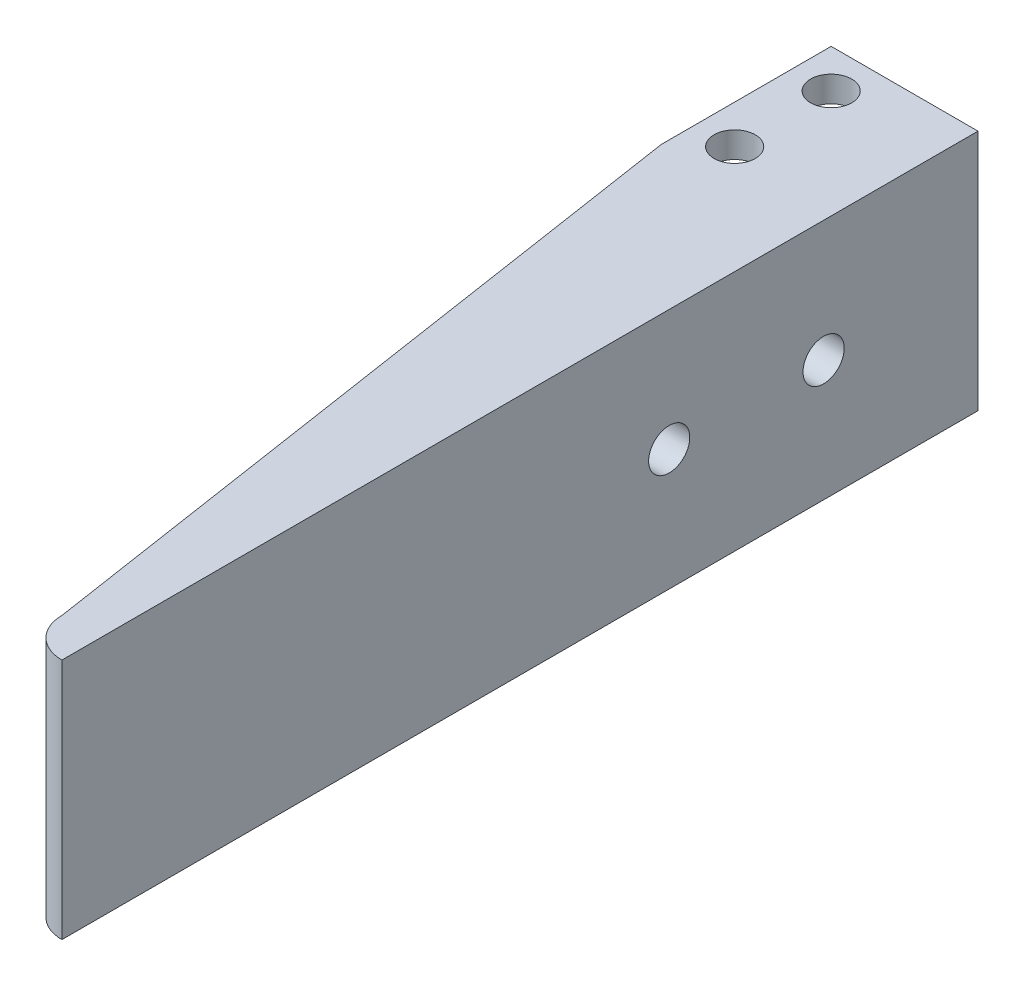
ISO-10303-21;
HEADER;
FILE_DESCRIPTION(('STEP AP214'),'2;1');
FILE_NAME('part.step','',(''),(''),'','','');
FILE_SCHEMA(('AUTOMOTIVE_DESIGN { 1 0 10303 214 1 1 1 1 }'));
ENDSEC;
DATA;
#1=APPLICATION_CONTEXT('core data for automotive mechanical design processes');
#2=APPLICATION_PROTOCOL_DEFINITION('international standard','automotive_design',2000,#1);
#3=PRODUCT_CONTEXT('',#1,'mechanical');
#4=PRODUCT('Part','Part','',(#3));
#5=PRODUCT_RELATED_PRODUCT_CATEGORY('part','',(#4));
#6=PRODUCT_DEFINITION_FORMATION('','',#4);
#7=PRODUCT_DEFINITION_CONTEXT('part definition',#1,'design');
#8=PRODUCT_DEFINITION('design','',#6,#7);
#9=PRODUCT_DEFINITION_SHAPE('','',#8);
#10=(LENGTH_UNIT() NAMED_UNIT(*) SI_UNIT(.MILLI.,.METRE.));
#11=(NAMED_UNIT(*) PLANE_ANGLE_UNIT() SI_UNIT($,.RADIAN.));
#12=(NAMED_UNIT(*) SI_UNIT($,.STERADIAN.) SOLID_ANGLE_UNIT());
#13=UNCERTAINTY_MEASURE_WITH_UNIT(LENGTH_MEASURE(1.E-05),#10,'distance_accuracy_value','');
#14=(GEOMETRIC_REPRESENTATION_CONTEXT(3) GLOBAL_UNCERTAINTY_ASSIGNED_CONTEXT((#13)) GLOBAL_UNIT_ASSIGNED_CONTEXT((#10,
#11,#12)) REPRESENTATION_CONTEXT('',''));
#15=CARTESIAN_POINT('',(0.,0.,0.));
#16=DIRECTION('',(0.,0.,1.));
#17=DIRECTION('',(1.,0.,0.));
#18=AXIS2_PLACEMENT_3D('',#15,#16,#17);
#19=CARTESIAN_POINT('',(5.70625000000002,0.,68.2));
#20=DIRECTION('',(0.,1.,0.));
#21=DIRECTION('',(0.,0.,1.));
#22=AXIS2_PLACEMENT_3D('',#19,#20,#21);
#23=PLANE('',#22);
#24=CARTESIAN_POINT('',(-2.70625,0.,10.5));
#25=DIRECTION('',(0.,1.,0.));
#26=DIRECTION('',(0.,0.,1.));
#27=AXIS2_PLACEMENT_3D('',#24,#25,#26);
#28=CIRCLE('',#27,1.6);
#29=CARTESIAN_POINT('',(-2.70625,0.,12.1));
#30=VERTEX_POINT('',#29);
#31=EDGE_CURVE('E192',#30,#30,#28,.T.);
#32=ORIENTED_EDGE('',*,*,#31,.T.);
#33=EDGE_LOOP('',(#32));
#34=FACE_BOUND('',#33,.T.);
#35=CARTESIAN_POINT('',(-2.70625,0.,3.));
#36=DIRECTION('',(0.,1.,0.));
#37=DIRECTION('',(0.,0.,1.));
#38=AXIS2_PLACEMENT_3D('',#35,#36,#37);
#39=CIRCLE('',#38,1.6);
#40=CARTESIAN_POINT('',(-2.70625,0.,4.6));
#41=VERTEX_POINT('',#40);
#42=EDGE_CURVE('E196',#41,#41,#39,.T.);
#43=ORIENTED_EDGE('',*,*,#42,.T.);
#44=EDGE_LOOP('',(#43));
#45=FACE_BOUND('',#44,.T.);
#46=DIRECTION('',(0.,0.,-1.));
#47=VECTOR('',#46,1.);
#48=CARTESIAN_POINT('',(2.70625000000002,0.,68.2));
#49=LINE('',#48,#47);
#50=CARTESIAN_POINT('',(2.70625000000002,0.,68.2));
#51=VERTEX_POINT('',#50);
#52=CARTESIAN_POINT('',(2.70625000000003,0.,0.));
#53=VERTEX_POINT('',#52);
#54=EDGE_CURVE('E67',#51,#53,#49,.T.);
#55=ORIENTED_EDGE('',*,*,#54,.F.);
#56=DIRECTION('',(0.151196146520445,0.,0.988503781114351));
#57=VECTOR('',#56,1.);
#58=CARTESIAN_POINT('',(-5.70625,0.,13.2));
#59=LINE('',#58,#57);
#60=CARTESIAN_POINT('',(-5.70625,0.,13.2));
#61=VERTEX_POINT('',#60);
#62=EDGE_CURVE('E120',#61,#51,#59,.T.);
#63=ORIENTED_EDGE('',*,*,#62,.F.);
#64=DIRECTION('',(0.,0.,1.));
#65=VECTOR('',#64,1.);
#66=CARTESIAN_POINT('',(-5.70625,0.,0.));
#67=LINE('',#66,#65);
#68=CARTESIAN_POINT('',(-5.70625,0.,0.));
#69=VERTEX_POINT('',#68);
#70=EDGE_CURVE('E117',#69,#61,#67,.T.);
#71=ORIENTED_EDGE('',*,*,#70,.F.);
#72=DIRECTION('',(-1.,0.,0.));
#73=VECTOR('',#72,1.);
#74=CARTESIAN_POINT('',(-5.70625,0.,0.));
#75=LINE('',#74,#73);
#76=EDGE_CURVE('E73',#53,#69,#75,.T.);
#77=ORIENTED_EDGE('',*,*,#76,.F.);
#78=EDGE_LOOP('',(#55,#63,#71,#77));
#79=FACE_BOUND('',#78,.T.);
#80=ADVANCED_FACE('F34',(#34,#45,#79),#23,.F.);
#81=CARTESIAN_POINT('',(5.70625000000002,2.,68.2));
#82=DIRECTION('',(0.,1.,0.));
#83=DIRECTION('',(0.,0.,1.));
#84=AXIS2_PLACEMENT_3D('',#81,#82,#83);
#85=PLANE('',#84);
#86=CARTESIAN_POINT('',(-2.70625,2.,3.));
#87=DIRECTION('',(0.,1.,0.));
#88=DIRECTION('',(0.,0.,1.));
#89=AXIS2_PLACEMENT_3D('',#86,#87,#88);
#90=CIRCLE('',#89,1.6);
#91=CARTESIAN_POINT('',(-2.70625,2.,4.6));
#92=VERTEX_POINT('',#91);
#93=EDGE_CURVE('E121',#92,#92,#90,.T.);
#94=ORIENTED_EDGE('',*,*,#93,.F.);
#95=EDGE_LOOP('',(#94));
#96=FACE_BOUND('',#95,.T.);
#97=DIRECTION('',(0.,0.,1.));
#98=VECTOR('',#97,1.);
#99=CARTESIAN_POINT('',(-5.70625,2.,0.));
#100=LINE('',#99,#98);
#101=CARTESIAN_POINT('',(-5.70625,2.,0.));
#102=VERTEX_POINT('',#101);
#103=CARTESIAN_POINT('',(-5.70625,2.,13.2));
#104=VERTEX_POINT('',#103);
#105=EDGE_CURVE('E124',#102,#104,#100,.T.);
#106=ORIENTED_EDGE('',*,*,#105,.T.);
#107=DIRECTION('',(0.151196146520445,0.,0.988503781114351));
#108=VECTOR('',#107,1.);
#109=CARTESIAN_POINT('',(-5.70625,2.,13.2));
#110=LINE('',#109,#108);
#111=CARTESIAN_POINT('',(2.70625000000002,2.,68.2));
#112=VERTEX_POINT('',#111);
#113=EDGE_CURVE('E81',#104,#112,#110,.T.);
#114=ORIENTED_EDGE('',*,*,#113,.T.);
#115=CARTESIAN_POINT('',(5.70625000000002,2.,68.2));
#116=DIRECTION('',(0.,1.,0.));
#117=DIRECTION('',(0.,0.,1.));
#118=AXIS2_PLACEMENT_3D('',#115,#116,#117);
#119=CIRCLE('',#118,3.);
#120=CARTESIAN_POINT('',(5.70625000000001,2.,71.2));
#121=VERTEX_POINT('',#120);
#122=EDGE_CURVE('E87',#112,#121,#119,.T.);
#123=ORIENTED_EDGE('',*,*,#122,.T.);
#124=DIRECTION('',(0.,0.,-1.));
#125=VECTOR('',#124,1.);
#126=CARTESIAN_POINT('',(5.70625000000001,2.,71.2));
#127=LINE('',#126,#125);
#128=CARTESIAN_POINT('',(5.70625,2.,0.));
#129=VERTEX_POINT('',#128);
#130=EDGE_CURVE('E92',#121,#129,#127,.T.);
#131=ORIENTED_EDGE('',*,*,#130,.T.);
#132=DIRECTION('',(-1.,0.,0.));
#133=VECTOR('',#132,1.);
#134=CARTESIAN_POINT('',(-5.70625,2.,0.));
#135=LINE('',#134,#133);
#136=EDGE_CURVE('E53',#129,#102,#135,.T.);
#137=ORIENTED_EDGE('',*,*,#136,.T.);
#138=EDGE_LOOP('',(#106,#114,#123,#131,#137));
#139=FACE_BOUND('',#138,.T.);
#140=CARTESIAN_POINT('',(-2.70625,2.,10.5));
#141=DIRECTION('',(0.,1.,0.));
#142=DIRECTION('',(0.,0.,1.));
#143=AXIS2_PLACEMENT_3D('',#140,#141,#142);
#144=CIRCLE('',#143,1.6);
#145=CARTESIAN_POINT('',(-2.70625,2.,12.1));
#146=VERTEX_POINT('',#145);
#147=EDGE_CURVE('E193',#146,#146,#144,.T.);
#148=ORIENTED_EDGE('',*,*,#147,.F.);
#149=EDGE_LOOP('',(#148));
#150=FACE_BOUND('',#149,.T.);
#151=ADVANCED_FACE('F89',(#96,#139,#150),#85,.T.);
#152=CARTESIAN_POINT('',(-5.70625,2.,0.));
#153=DIRECTION('',(1.,0.,0.));
#154=DIRECTION('',(0.,0.,-1.));
#155=AXIS2_PLACEMENT_3D('',#152,#153,#154);
#156=PLANE('',#155);
#157=ORIENTED_EDGE('',*,*,#70,.T.);
#158=DIRECTION('',(0.,-1.,0.));
#159=VECTOR('',#158,1.);
#160=CARTESIAN_POINT('',(-5.70625,2.,13.2));
#161=LINE('',#160,#159);
#162=EDGE_CURVE('E11',#104,#61,#161,.T.);
#163=ORIENTED_EDGE('',*,*,#162,.F.);
#164=ORIENTED_EDGE('',*,*,#105,.F.);
#165=DIRECTION('',(0.,-1.,0.));
#166=VECTOR('',#165,1.);
#167=CARTESIAN_POINT('',(-5.70625,2.,0.));
#168=LINE('',#167,#166);
#169=EDGE_CURVE('E113',#102,#69,#168,.T.);
#170=ORIENTED_EDGE('',*,*,#169,.T.);
#171=EDGE_LOOP('',(#157,#163,#164,#170));
#172=FACE_BOUND('',#171,.T.);
#173=ADVANCED_FACE('F36',(#172),#156,.F.);
#174=CARTESIAN_POINT('',(-5.70625,2.,13.2));
#175=DIRECTION('',(0.988503781114351,0.,-0.151196146520445));
#176=DIRECTION('',(-0.151196146520445,0.,-0.988503781114351));
#177=AXIS2_PLACEMENT_3D('',#174,#175,#176);
#178=PLANE('',#177);
#179=ORIENTED_EDGE('',*,*,#62,.T.);
#180=DIRECTION('',(0.,-1.,0.));
#181=VECTOR('',#180,1.);
#182=CARTESIAN_POINT('',(2.70625000000002,2.,68.2));
#183=LINE('',#182,#181);
#184=EDGE_CURVE('E44',#112,#51,#183,.T.);
#185=ORIENTED_EDGE('',*,*,#184,.F.);
#186=ORIENTED_EDGE('',*,*,#113,.F.);
#187=ORIENTED_EDGE('',*,*,#162,.T.);
#188=EDGE_LOOP('',(#179,#185,#186,#187));
#189=FACE_BOUND('',#188,.T.);
#190=ADVANCED_FACE('F207',(#189),#178,.F.);
#191=CARTESIAN_POINT('',(5.70625000000002,2.,68.2));
#192=DIRECTION('',(0.,-1.,0.));
#193=DIRECTION('',(0.,0.,-1.));
#194=AXIS2_PLACEMENT_3D('',#191,#192,#193);
#195=CYLINDRICAL_SURFACE('',#194,3.);
#196=ORIENTED_EDGE('',*,*,#184,.T.);
#197=DIRECTION('',(0.,1.,0.));
#198=VECTOR('',#197,1.);
#199=CARTESIAN_POINT('',(2.70625000000002,-7.41,68.2));
#200=LINE('',#199,#198);
#201=CARTESIAN_POINT('',(2.70625000000002,-14.82,68.2));
#202=VERTEX_POINT('',#201);
#203=EDGE_CURVE('E189',#202,#51,#200,.T.);
#204=ORIENTED_EDGE('',*,*,#203,.F.);
#205=DIRECTION('',(0.,1.,0.));
#206=VECTOR('',#205,1.);
#207=CARTESIAN_POINT('',(2.70625000000002,-16.82,68.2));
#208=LINE('',#207,#206);
#209=CARTESIAN_POINT('',(2.70625000000002,-16.82,68.2));
#210=VERTEX_POINT('',#209);
#211=EDGE_CURVE('E177',#210,#202,#208,.T.);
#212=ORIENTED_EDGE('',*,*,#211,.F.);
#213=CARTESIAN_POINT('',(5.70625000000002,-16.82,68.2));
#214=DIRECTION('',(0.,1.,0.));
#215=DIRECTION('',(0.,0.,1.));
#216=AXIS2_PLACEMENT_3D('',#213,#214,#215);
#217=CIRCLE('',#216,3.);
#218=CARTESIAN_POINT('',(5.70625000000001,-16.82,71.2));
#219=VERTEX_POINT('',#218);
#220=EDGE_CURVE('E104',#210,#219,#217,.T.);
#221=ORIENTED_EDGE('',*,*,#220,.T.);
#222=DIRECTION('',(0.,-1.,0.));
#223=VECTOR('',#222,1.);
#224=CARTESIAN_POINT('',(5.70625000000001,2.,71.2));
#225=LINE('',#224,#223);
#226=EDGE_CURVE('E99',#121,#219,#225,.T.);
#227=ORIENTED_EDGE('',*,*,#226,.F.);
#228=ORIENTED_EDGE('',*,*,#122,.F.);
#229=EDGE_LOOP('',(#196,#204,#212,#221,#227,#228));
#230=FACE_BOUND('',#229,.T.);
#231=ADVANCED_FACE('F100',(#230),#195,.T.);
#232=CARTESIAN_POINT('',(5.70625000000001,2.,71.2));
#233=DIRECTION('',(-1.,0.,0.));
#234=DIRECTION('',(0.,0.,1.));
#235=AXIS2_PLACEMENT_3D('',#232,#233,#234);
#236=PLANE('',#235);
#237=CARTESIAN_POINT('',(5.70625000000002,-7.41,24.));
#238=DIRECTION('',(-1.,0.,0.));
#239=DIRECTION('',(0.,0.,1.));
#240=AXIS2_PLACEMENT_3D('',#237,#238,#239);
#241=CIRCLE('',#240,1.6);
#242=CARTESIAN_POINT('',(5.70625000000002,-7.41,25.6));
#243=VERTEX_POINT('',#242);
#244=EDGE_CURVE('E129',#243,#243,#241,.T.);
#245=ORIENTED_EDGE('',*,*,#244,.T.);
#246=EDGE_LOOP('',(#245));
#247=FACE_BOUND('',#246,.T.);
#248=CARTESIAN_POINT('',(5.70625000000002,-7.41,12.));
#249=DIRECTION('',(-1.,0.,0.));
#250=DIRECTION('',(0.,0.,1.));
#251=AXIS2_PLACEMENT_3D('',#248,#249,#250);
#252=CIRCLE('',#251,1.6);
#253=CARTESIAN_POINT('',(5.70625000000002,-7.41,13.6));
#254=VERTEX_POINT('',#253);
#255=EDGE_CURVE('E135',#254,#254,#252,.T.);
#256=ORIENTED_EDGE('',*,*,#255,.T.);
#257=EDGE_LOOP('',(#256));
#258=FACE_BOUND('',#257,.T.);
#259=ORIENTED_EDGE('',*,*,#226,.T.);
#260=DIRECTION('',(0.,0.,-1.));
#261=VECTOR('',#260,1.);
#262=CARTESIAN_POINT('',(5.70625000000001,-16.82,71.2));
#263=LINE('',#262,#261);
#264=CARTESIAN_POINT('',(5.70625,-16.82,0.));
#265=VERTEX_POINT('',#264);
#266=EDGE_CURVE('E161',#219,#265,#263,.T.);
#267=ORIENTED_EDGE('',*,*,#266,.T.);
#268=DIRECTION('',(0.,-1.,0.));
#269=VECTOR('',#268,1.);
#270=CARTESIAN_POINT('',(5.70625,2.,0.));
#271=LINE('',#270,#269);
#272=EDGE_CURVE('E108',#129,#265,#271,.T.);
#273=ORIENTED_EDGE('',*,*,#272,.F.);
#274=ORIENTED_EDGE('',*,*,#130,.F.);
#275=EDGE_LOOP('',(#259,#267,#273,#274));
#276=FACE_BOUND('',#275,.T.);
#277=ADVANCED_FACE('F110',(#247,#258,#276),#236,.F.);
#278=CARTESIAN_POINT('',(-5.70625,2.,0.));
#279=DIRECTION('',(0.,0.,1.));
#280=DIRECTION('',(1.,0.,0.));
#281=AXIS2_PLACEMENT_3D('',#278,#279,#280);
#282=PLANE('',#281);
#283=ORIENTED_EDGE('',*,*,#272,.T.);
#284=DIRECTION('',(-1.,0.,0.));
#285=VECTOR('',#284,1.);
#286=CARTESIAN_POINT('',(-5.70625,-16.82,0.));
#287=LINE('',#286,#285);
#288=CARTESIAN_POINT('',(-5.70625,-16.82,0.));
#289=VERTEX_POINT('',#288);
#290=EDGE_CURVE('E157',#265,#289,#287,.T.);
#291=ORIENTED_EDGE('',*,*,#290,.T.);
#292=DIRECTION('',(0.,1.,0.));
#293=VECTOR('',#292,1.);
#294=CARTESIAN_POINT('',(-5.70625,-16.82,0.));
#295=LINE('',#294,#293);
#296=CARTESIAN_POINT('',(-5.70625,-14.82,0.));
#297=VERTEX_POINT('',#296);
#298=EDGE_CURVE('E180',#289,#297,#295,.T.);
#299=ORIENTED_EDGE('',*,*,#298,.T.);
#300=DIRECTION('',(-1.,0.,0.));
#301=VECTOR('',#300,1.);
#302=CARTESIAN_POINT('',(-5.70625,-14.82,0.));
#303=LINE('',#302,#301);
#304=CARTESIAN_POINT('',(2.70625000000002,-14.82,0.));
#305=VERTEX_POINT('',#304);
#306=EDGE_CURVE('E170',#305,#297,#303,.T.);
#307=ORIENTED_EDGE('',*,*,#306,.F.);
#308=DIRECTION('',(0.,1.,0.));
#309=VECTOR('',#308,1.);
#310=CARTESIAN_POINT('',(2.70625000000003,-7.41,0.));
#311=LINE('',#310,#309);
#312=EDGE_CURVE('E187',#305,#53,#311,.T.);
#313=ORIENTED_EDGE('',*,*,#312,.T.);
#314=ORIENTED_EDGE('',*,*,#76,.T.);
#315=ORIENTED_EDGE('',*,*,#169,.F.);
#316=ORIENTED_EDGE('',*,*,#136,.F.);
#317=EDGE_LOOP('',(#283,#291,#299,#307,#313,#314,#315,#316));
#318=FACE_BOUND('',#317,.T.);
#319=ADVANCED_FACE('F243',(#318),#282,.F.);
#320=CARTESIAN_POINT('',(-2.70625,2.,3.));
#321=DIRECTION('',(0.,-1.,0.));
#322=DIRECTION('',(0.,0.,-1.));
#323=AXIS2_PLACEMENT_3D('',#320,#321,#322);
#324=CYLINDRICAL_SURFACE('',#323,1.6);
#325=ORIENTED_EDGE('',*,*,#93,.T.);
#326=EDGE_LOOP('',(#325));
#327=FACE_BOUND('',#326,.T.);
#328=ORIENTED_EDGE('',*,*,#42,.F.);
#329=EDGE_LOOP('',(#328));
#330=FACE_BOUND('',#329,.T.);
#331=ADVANCED_FACE('F273',(#327,#330),#324,.F.);
#332=CARTESIAN_POINT('',(-2.70625,2.,10.5));
#333=DIRECTION('',(0.,-1.,0.));
#334=DIRECTION('',(0.,0.,-1.));
#335=AXIS2_PLACEMENT_3D('',#332,#333,#334);
#336=CYLINDRICAL_SURFACE('',#335,1.6);
#337=ORIENTED_EDGE('',*,*,#147,.T.);
#338=EDGE_LOOP('',(#337));
#339=FACE_BOUND('',#338,.T.);
#340=ORIENTED_EDGE('',*,*,#31,.F.);
#341=EDGE_LOOP('',(#340));
#342=FACE_BOUND('',#341,.T.);
#343=ADVANCED_FACE('F327',(#339,#342),#336,.F.);
#344=CARTESIAN_POINT('',(2.70625000000002,-7.41,68.2));
#345=DIRECTION('',(1.,0.,0.));
#346=DIRECTION('',(0.,0.,-1.));
#347=AXIS2_PLACEMENT_3D('',#344,#345,#346);
#348=PLANE('',#347);
#349=CARTESIAN_POINT('',(2.70625000000002,-7.41,24.));
#350=DIRECTION('',(1.,0.,0.));
#351=DIRECTION('',(0.,0.,-1.));
#352=AXIS2_PLACEMENT_3D('',#349,#350,#351);
#353=CIRCLE('',#352,1.6);
#354=CARTESIAN_POINT('',(2.70625000000002,-7.41,22.4));
#355=VERTEX_POINT('',#354);
#356=EDGE_CURVE('E38',#355,#355,#353,.T.);
#357=ORIENTED_EDGE('',*,*,#356,.T.);
#358=EDGE_LOOP('',(#357));
#359=FACE_BOUND('',#358,.T.);
#360=CARTESIAN_POINT('',(2.70625000000002,-7.41,12.));
#361=DIRECTION('',(1.,0.,0.));
#362=DIRECTION('',(0.,0.,-1.));
#363=AXIS2_PLACEMENT_3D('',#360,#361,#362);
#364=CIRCLE('',#363,1.6);
#365=CARTESIAN_POINT('',(2.70625000000002,-7.41,10.4));
#366=VERTEX_POINT('',#365);
#367=EDGE_CURVE('E127',#366,#366,#364,.T.);
#368=ORIENTED_EDGE('',*,*,#367,.T.);
#369=EDGE_LOOP('',(#368));
#370=FACE_BOUND('',#369,.T.);
#371=ORIENTED_EDGE('',*,*,#54,.T.);
#372=ORIENTED_EDGE('',*,*,#312,.F.);
#373=DIRECTION('',(0.,0.,-1.));
#374=VECTOR('',#373,1.);
#375=CARTESIAN_POINT('',(2.70625000000002,-14.82,68.2));
#376=LINE('',#375,#374);
#377=EDGE_CURVE('E183',#202,#305,#376,.T.);
#378=ORIENTED_EDGE('',*,*,#377,.F.);
#379=ORIENTED_EDGE('',*,*,#203,.T.);
#380=EDGE_LOOP('',(#371,#372,#378,#379));
#381=FACE_BOUND('',#380,.T.);
#382=ADVANCED_FACE('F212',(#359,#370,#381),#348,.F.);
#383=CARTESIAN_POINT('',(5.70625000000002,-14.82,68.2));
#384=DIRECTION('',(0.,-1.,0.));
#385=DIRECTION('',(0.,0.,1.));
#386=AXIS2_PLACEMENT_3D('',#383,#384,#385);
#387=PLANE('',#386);
#388=CARTESIAN_POINT('',(-2.70625,-14.82,10.5));
#389=DIRECTION('',(0.,1.,0.));
#390=DIRECTION('',(0.,0.,1.));
#391=AXIS2_PLACEMENT_3D('',#388,#389,#390);
#392=CIRCLE('',#391,1.6);
#393=CARTESIAN_POINT('',(-2.70625,-14.82,12.1));
#394=VERTEX_POINT('',#393);
#395=EDGE_CURVE('E133',#394,#394,#392,.T.);
#396=ORIENTED_EDGE('',*,*,#395,.F.);
#397=EDGE_LOOP('',(#396));
#398=FACE_BOUND('',#397,.T.);
#399=CARTESIAN_POINT('',(-2.70625,-14.82,3.));
#400=DIRECTION('',(0.,1.,0.));
#401=DIRECTION('',(0.,0.,1.));
#402=AXIS2_PLACEMENT_3D('',#399,#400,#401);
#403=CIRCLE('',#402,1.6);
#404=CARTESIAN_POINT('',(-2.70625,-14.82,4.6));
#405=VERTEX_POINT('',#404);
#406=EDGE_CURVE('E145',#405,#405,#403,.T.);
#407=ORIENTED_EDGE('',*,*,#406,.F.);
#408=EDGE_LOOP('',(#407));
#409=FACE_BOUND('',#408,.T.);
#410=DIRECTION('',(0.151196146520445,0.,0.988503781114351));
#411=VECTOR('',#410,1.);
#412=CARTESIAN_POINT('',(-5.70625,-14.82,13.2));
#413=LINE('',#412,#411);
#414=CARTESIAN_POINT('',(-5.70625,-14.82,13.2));
#415=VERTEX_POINT('',#414);
#416=EDGE_CURVE('E158',#415,#202,#413,.T.);
#417=ORIENTED_EDGE('',*,*,#416,.T.);
#418=ORIENTED_EDGE('',*,*,#377,.T.);
#419=ORIENTED_EDGE('',*,*,#306,.T.);
#420=DIRECTION('',(0.,0.,1.));
#421=VECTOR('',#420,1.);
#422=CARTESIAN_POINT('',(-5.70625,-14.82,0.));
#423=LINE('',#422,#421);
#424=EDGE_CURVE('E151',#297,#415,#423,.T.);
#425=ORIENTED_EDGE('',*,*,#424,.T.);
#426=EDGE_LOOP('',(#417,#418,#419,#425));
#427=FACE_BOUND('',#426,.T.);
#428=ADVANCED_FACE('F224',(#398,#409,#427),#387,.F.);
#429=CARTESIAN_POINT('',(-5.70625,-16.82,0.));
#430=DIRECTION('',(-1.,0.,0.));
#431=DIRECTION('',(0.,0.,1.));
#432=AXIS2_PLACEMENT_3D('',#429,#430,#431);
#433=PLANE('',#432);
#434=ORIENTED_EDGE('',*,*,#424,.F.);
#435=ORIENTED_EDGE('',*,*,#298,.F.);
#436=DIRECTION('',(0.,0.,1.));
#437=VECTOR('',#436,1.);
#438=CARTESIAN_POINT('',(-5.70625,-16.82,0.));
#439=LINE('',#438,#437);
#440=CARTESIAN_POINT('',(-5.70625,-16.82,13.2));
#441=VERTEX_POINT('',#440);
#442=EDGE_CURVE('E154',#289,#441,#439,.T.);
#443=ORIENTED_EDGE('',*,*,#442,.T.);
#444=DIRECTION('',(0.,1.,0.));
#445=VECTOR('',#444,1.);
#446=CARTESIAN_POINT('',(-5.70625,-16.82,13.2));
#447=LINE('',#446,#445);
#448=EDGE_CURVE('E167',#441,#415,#447,.T.);
#449=ORIENTED_EDGE('',*,*,#448,.T.);
#450=EDGE_LOOP('',(#434,#435,#443,#449));
#451=FACE_BOUND('',#450,.T.);
#452=ADVANCED_FACE('F231',(#451),#433,.T.);
#453=CARTESIAN_POINT('',(-5.70625,-16.82,13.2));
#454=DIRECTION('',(-0.988503781114351,0.,0.151196146520445));
#455=DIRECTION('',(0.151196146520445,0.,0.988503781114351));
#456=AXIS2_PLACEMENT_3D('',#453,#454,#455);
#457=PLANE('',#456);
#458=ORIENTED_EDGE('',*,*,#416,.F.);
#459=ORIENTED_EDGE('',*,*,#448,.F.);
#460=DIRECTION('',(0.151196146520445,0.,0.988503781114351));
#461=VECTOR('',#460,1.);
#462=CARTESIAN_POINT('',(-5.70625,-16.82,13.2));
#463=LINE('',#462,#461);
#464=EDGE_CURVE('E164',#441,#210,#463,.T.);
#465=ORIENTED_EDGE('',*,*,#464,.T.);
#466=ORIENTED_EDGE('',*,*,#211,.T.);
#467=EDGE_LOOP('',(#458,#459,#465,#466));
#468=FACE_BOUND('',#467,.T.);
#469=ADVANCED_FACE('F219',(#468),#457,.T.);
#470=CARTESIAN_POINT('',(5.70625000000002,-16.82,68.2));
#471=DIRECTION('',(0.,-1.,0.));
#472=DIRECTION('',(0.,0.,1.));
#473=AXIS2_PLACEMENT_3D('',#470,#471,#472);
#474=PLANE('',#473);
#475=CARTESIAN_POINT('',(-2.70625,-16.82,10.5));
#476=DIRECTION('',(0.,1.,0.));
#477=DIRECTION('',(0.,0.,1.));
#478=AXIS2_PLACEMENT_3D('',#475,#476,#477);
#479=CIRCLE('',#478,1.6);
#480=CARTESIAN_POINT('',(-2.70625,-16.82,12.1));
#481=VERTEX_POINT('',#480);
#482=EDGE_CURVE('E142',#481,#481,#479,.T.);
#483=ORIENTED_EDGE('',*,*,#482,.T.);
#484=EDGE_LOOP('',(#483));
#485=FACE_BOUND('',#484,.T.);
#486=CARTESIAN_POINT('',(-2.70625,-16.82,3.));
#487=DIRECTION('',(0.,1.,0.));
#488=DIRECTION('',(0.,0.,1.));
#489=AXIS2_PLACEMENT_3D('',#486,#487,#488);
#490=CIRCLE('',#489,1.6);
#491=CARTESIAN_POINT('',(-2.70625,-16.82,4.6));
#492=VERTEX_POINT('',#491);
#493=EDGE_CURVE('E148',#492,#492,#490,.T.);
#494=ORIENTED_EDGE('',*,*,#493,.T.);
#495=EDGE_LOOP('',(#494));
#496=FACE_BOUND('',#495,.T.);
#497=ORIENTED_EDGE('',*,*,#442,.F.);
#498=ORIENTED_EDGE('',*,*,#290,.F.);
#499=ORIENTED_EDGE('',*,*,#266,.F.);
#500=ORIENTED_EDGE('',*,*,#220,.F.);
#501=ORIENTED_EDGE('',*,*,#464,.F.);
#502=EDGE_LOOP('',(#497,#498,#499,#500,#501));
#503=FACE_BOUND('',#502,.T.);
#504=ADVANCED_FACE('F245',(#485,#496,#503),#474,.T.);
#505=CARTESIAN_POINT('',(-2.70625,-16.82,3.));
#506=DIRECTION('',(0.,1.,0.));
#507=DIRECTION('',(0.,0.,1.));
#508=AXIS2_PLACEMENT_3D('',#505,#506,#507);
#509=CYLINDRICAL_SURFACE('',#508,1.6);
#510=ORIENTED_EDGE('',*,*,#493,.F.);
#511=EDGE_LOOP('',(#510));
#512=FACE_BOUND('',#511,.T.);
#513=ORIENTED_EDGE('',*,*,#406,.T.);
#514=EDGE_LOOP('',(#513));
#515=FACE_BOUND('',#514,.T.);
#516=ADVANCED_FACE('F247',(#512,#515),#509,.F.);
#517=CARTESIAN_POINT('',(-2.70625,-16.82,10.5));
#518=DIRECTION('',(0.,1.,0.));
#519=DIRECTION('',(0.,0.,1.));
#520=AXIS2_PLACEMENT_3D('',#517,#518,#519);
#521=CYLINDRICAL_SURFACE('',#520,1.6);
#522=ORIENTED_EDGE('',*,*,#482,.F.);
#523=EDGE_LOOP('',(#522));
#524=FACE_BOUND('',#523,.T.);
#525=ORIENTED_EDGE('',*,*,#395,.T.);
#526=EDGE_LOOP('',(#525));
#527=FACE_BOUND('',#526,.T.);
#528=ADVANCED_FACE('F254',(#524,#527),#521,.F.);
#529=CARTESIAN_POINT('',(5.70625000000002,-7.41,12.));
#530=DIRECTION('',(-1.,0.,0.));
#531=DIRECTION('',(0.,0.,1.));
#532=AXIS2_PLACEMENT_3D('',#529,#530,#531);
#533=CYLINDRICAL_SURFACE('',#532,1.6);
#534=ORIENTED_EDGE('',*,*,#255,.F.);
#535=EDGE_LOOP('',(#534));
#536=FACE_BOUND('',#535,.T.);
#537=ORIENTED_EDGE('',*,*,#367,.F.);
#538=EDGE_LOOP('',(#537));
#539=FACE_BOUND('',#538,.T.);
#540=ADVANCED_FACE('F384',(#536,#539),#533,.F.);
#541=CARTESIAN_POINT('',(5.70625000000002,-7.41,24.));
#542=DIRECTION('',(-1.,0.,0.));
#543=DIRECTION('',(0.,0.,1.));
#544=AXIS2_PLACEMENT_3D('',#541,#542,#543);
#545=CYLINDRICAL_SURFACE('',#544,1.6);
#546=ORIENTED_EDGE('',*,*,#244,.F.);
#547=EDGE_LOOP('',(#546));
#548=FACE_BOUND('',#547,.T.);
#549=ORIENTED_EDGE('',*,*,#356,.F.);
#550=EDGE_LOOP('',(#549));
#551=FACE_BOUND('',#550,.T.);
#552=ADVANCED_FACE('F423',(#548,#551),#545,.F.);
#553=CLOSED_SHELL('',(#80,#151,#173,#190,#231,#277,#319,#331,#343,#382,#428,#452,#469,#504,#516,
#528,#540,#552));
#554=MANIFOLD_SOLID_BREP('B2',#553);
#555=ADVANCED_BREP_SHAPE_REPRESENTATION('',(#18,#554),#14);
#556=SHAPE_DEFINITION_REPRESENTATION(#9,#555);
ENDSEC;
END-ISO-10303-21;
